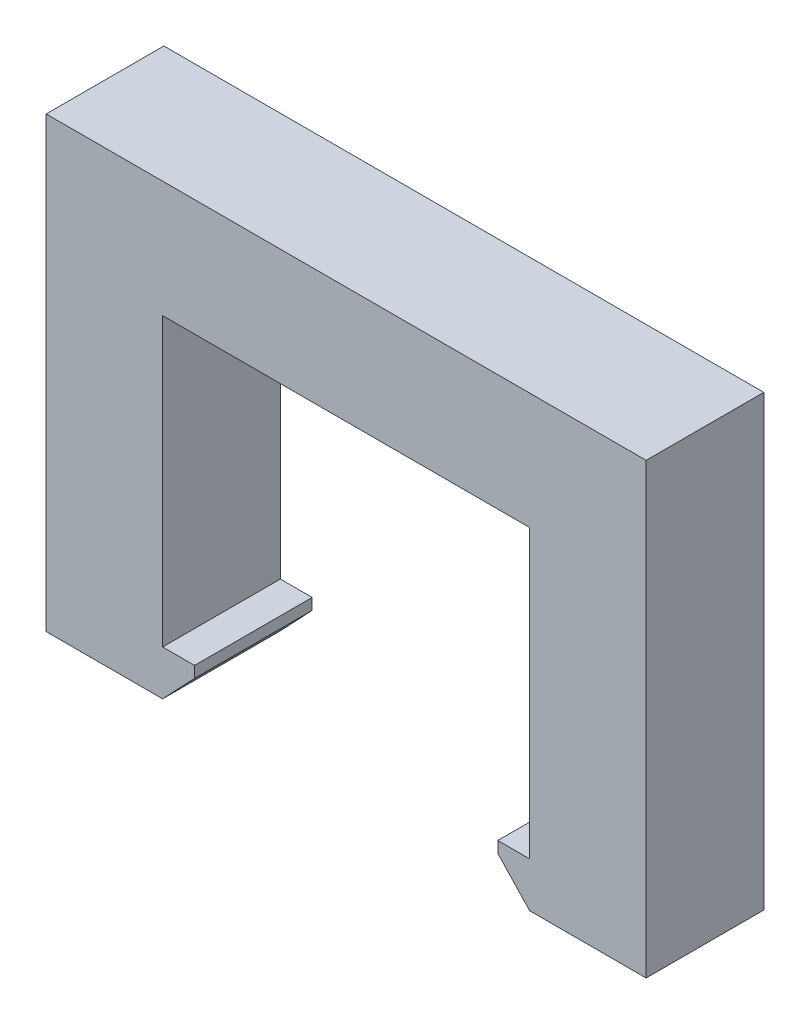
ISO-10303-21;
HEADER;
FILE_DESCRIPTION(('STEP AP214'),'2;1');
FILE_NAME('part.step','',(''),(''),'','','');
FILE_SCHEMA(('AUTOMOTIVE_DESIGN { 1 0 10303 214 1 1 1 1 }'));
ENDSEC;
DATA;
#1=APPLICATION_CONTEXT('core data for automotive mechanical design processes');
#2=APPLICATION_PROTOCOL_DEFINITION('international standard','automotive_design',2000,#1);
#3=PRODUCT_CONTEXT('',#1,'mechanical');
#4=PRODUCT('Part','Part','',(#3));
#5=PRODUCT_RELATED_PRODUCT_CATEGORY('part','',(#4));
#6=PRODUCT_DEFINITION_FORMATION('','',#4);
#7=PRODUCT_DEFINITION_CONTEXT('part definition',#1,'design');
#8=PRODUCT_DEFINITION('design','',#6,#7);
#9=PRODUCT_DEFINITION_SHAPE('','',#8);
#10=(LENGTH_UNIT() NAMED_UNIT(*) SI_UNIT(.MILLI.,.METRE.));
#11=(NAMED_UNIT(*) PLANE_ANGLE_UNIT() SI_UNIT($,.RADIAN.));
#12=(NAMED_UNIT(*) SI_UNIT($,.STERADIAN.) SOLID_ANGLE_UNIT());
#13=UNCERTAINTY_MEASURE_WITH_UNIT(LENGTH_MEASURE(1.E-05),#10,'distance_accuracy_value','');
#14=(GEOMETRIC_REPRESENTATION_CONTEXT(3) GLOBAL_UNCERTAINTY_ASSIGNED_CONTEXT((#13)) GLOBAL_UNIT_ASSIGNED_CONTEXT((#10,
#11,#12)) REPRESENTATION_CONTEXT('',''));
#15=CARTESIAN_POINT('',(0.,0.,0.));
#16=DIRECTION('',(0.,0.,1.));
#17=DIRECTION('',(1.,0.,0.));
#18=AXIS2_PLACEMENT_3D('',#15,#16,#17);
#19=CARTESIAN_POINT('',(0.,0.,12.8016));
#20=DIRECTION('',(0.,-1.,0.));
#21=DIRECTION('',(1.,0.,0.));
#22=AXIS2_PLACEMENT_3D('',#19,#20,#21);
#23=PLANE('',#22);
#24=DIRECTION('',(-1.,0.,0.));
#25=VECTOR('',#24,1.);
#26=CARTESIAN_POINT('',(0.,0.,0.));
#27=LINE('',#26,#25);
#28=CARTESIAN_POINT('',(32.6321247424681,0.,0.));
#29=VERTEX_POINT('',#28);
#30=CARTESIAN_POINT('',(-32.6321247424681,0.,0.));
#31=VERTEX_POINT('',#30);
#32=EDGE_CURVE('E107',#29,#31,#27,.T.);
#33=ORIENTED_EDGE('',*,*,#32,.T.);
#34=DIRECTION('',(0.,0.,-1.));
#35=VECTOR('',#34,1.);
#36=CARTESIAN_POINT('',(-32.6321247424681,0.,12.8016));
#37=LINE('',#36,#35);
#38=CARTESIAN_POINT('',(-32.6321247424681,0.,12.8016));
#39=VERTEX_POINT('',#38);
#40=EDGE_CURVE('E11',#39,#31,#37,.T.);
#41=ORIENTED_EDGE('',*,*,#40,.F.);
#42=DIRECTION('',(-1.,0.,0.));
#43=VECTOR('',#42,1.);
#44=CARTESIAN_POINT('',(0.,0.,12.8016));
#45=LINE('',#44,#43);
#46=CARTESIAN_POINT('',(32.6321247424681,0.,12.8016));
#47=VERTEX_POINT('',#46);
#48=EDGE_CURVE('E114',#47,#39,#45,.T.);
#49=ORIENTED_EDGE('',*,*,#48,.F.);
#50=DIRECTION('',(0.,0.,-1.));
#51=VECTOR('',#50,1.);
#52=CARTESIAN_POINT('',(32.6321247424681,0.,12.8016));
#53=LINE('',#52,#51);
#54=EDGE_CURVE('E170',#47,#29,#53,.T.);
#55=ORIENTED_EDGE('',*,*,#54,.T.);
#56=EDGE_LOOP('',(#33,#41,#49,#55));
#57=FACE_BOUND('',#56,.T.);
#58=ADVANCED_FACE('F39',(#57),#23,.F.);
#59=CARTESIAN_POINT('',(-32.6321247424681,0.,12.8016));
#60=DIRECTION('',(1.,0.,0.));
#61=DIRECTION('',(0.,1.,0.));
#62=AXIS2_PLACEMENT_3D('',#59,#60,#61);
#63=PLANE('',#62);
#64=DIRECTION('',(0.,-1.,0.));
#65=VECTOR('',#64,1.);
#66=CARTESIAN_POINT('',(-32.6321247424681,0.,0.));
#67=LINE('',#66,#65);
#68=CARTESIAN_POINT('',(-32.6321247424681,-48.7706757589646,0.));
#69=VERTEX_POINT('',#68);
#70=EDGE_CURVE('E175',#31,#69,#67,.T.);
#71=ORIENTED_EDGE('',*,*,#70,.T.);
#72=DIRECTION('',(0.,0.,-1.));
#73=VECTOR('',#72,1.);
#74=CARTESIAN_POINT('',(-32.6321247424681,-48.7706757589646,12.8016));
#75=LINE('',#74,#73);
#76=CARTESIAN_POINT('',(-32.6321247424681,-48.7706757589646,12.8016));
#77=VERTEX_POINT('',#76);
#78=EDGE_CURVE('E50',#77,#69,#75,.T.);
#79=ORIENTED_EDGE('',*,*,#78,.F.);
#80=DIRECTION('',(0.,-1.,0.));
#81=VECTOR('',#80,1.);
#82=CARTESIAN_POINT('',(-32.6321247424681,0.,12.8016));
#83=LINE('',#82,#81);
#84=EDGE_CURVE('E274',#39,#77,#83,.T.);
#85=ORIENTED_EDGE('',*,*,#84,.F.);
#86=ORIENTED_EDGE('',*,*,#40,.T.);
#87=EDGE_LOOP('',(#71,#79,#85,#86));
#88=FACE_BOUND('',#87,.T.);
#89=ADVANCED_FACE('F280',(#88),#63,.F.);
#90=CARTESIAN_POINT('',(-32.6321247424681,-48.7706757589646,12.8016));
#91=DIRECTION('',(0.,1.,0.));
#92=DIRECTION('',(0.,0.,1.));
#93=AXIS2_PLACEMENT_3D('',#90,#91,#92);
#94=PLANE('',#93);
#95=DIRECTION('',(1.,0.,0.));
#96=VECTOR('',#95,1.);
#97=CARTESIAN_POINT('',(-32.6321247424681,-48.7706757589646,0.));
#98=LINE('',#97,#96);
#99=CARTESIAN_POINT('',(-19.9644,-48.7706757589646,0.));
#100=VERTEX_POINT('',#99);
#101=EDGE_CURVE('E172',#69,#100,#98,.T.);
#102=ORIENTED_EDGE('',*,*,#101,.T.);
#103=DIRECTION('',(0.,0.,-1.));
#104=VECTOR('',#103,1.);
#105=CARTESIAN_POINT('',(-19.9644,-48.7706757589646,12.8016));
#106=LINE('',#105,#104);
#107=CARTESIAN_POINT('',(-19.9644,-48.7706757589646,12.8016));
#108=VERTEX_POINT('',#107);
#109=EDGE_CURVE('E222',#108,#100,#106,.T.);
#110=ORIENTED_EDGE('',*,*,#109,.F.);
#111=DIRECTION('',(1.,0.,0.));
#112=VECTOR('',#111,1.);
#113=CARTESIAN_POINT('',(-32.6321247424681,-48.7706757589646,12.8016));
#114=LINE('',#113,#112);
#115=EDGE_CURVE('E229',#77,#108,#114,.T.);
#116=ORIENTED_EDGE('',*,*,#115,.F.);
#117=ORIENTED_EDGE('',*,*,#78,.T.);
#118=EDGE_LOOP('',(#102,#110,#116,#117));
#119=FACE_BOUND('',#118,.T.);
#120=ADVANCED_FACE('F226',(#119),#94,.F.);
#121=CARTESIAN_POINT('',(-19.9644,-48.7706757589646,12.8016));
#122=DIRECTION('',(-0.726425661410118,0.687245049778369,0.));
#123=DIRECTION('',(-0.687245049778369,-0.726425661410118,0.));
#124=AXIS2_PLACEMENT_3D('',#121,#122,#123);
#125=PLANE('',#124);
#126=DIRECTION('',(0.687245049778369,0.726425661410118,0.));
#127=VECTOR('',#126,1.);
#128=CARTESIAN_POINT('',(-19.9644,-48.7706757589646,0.));
#129=LINE('',#128,#127);
#130=CARTESIAN_POINT('',(-16.4973,-45.1059124965922,0.));
#131=VERTEX_POINT('',#130);
#132=EDGE_CURVE('E176',#100,#131,#129,.T.);
#133=ORIENTED_EDGE('',*,*,#132,.T.);
#134=DIRECTION('',(0.,0.,-1.));
#135=VECTOR('',#134,1.);
#136=CARTESIAN_POINT('',(-16.4973,-45.1059124965922,12.8016));
#137=LINE('',#136,#135);
#138=CARTESIAN_POINT('',(-16.4973,-45.1059124965922,12.8016));
#139=VERTEX_POINT('',#138);
#140=EDGE_CURVE('E219',#139,#131,#137,.T.);
#141=ORIENTED_EDGE('',*,*,#140,.F.);
#142=DIRECTION('',(0.687245049778369,0.726425661410118,0.));
#143=VECTOR('',#142,1.);
#144=CARTESIAN_POINT('',(-19.9644,-48.7706757589646,12.8016));
#145=LINE('',#144,#143);
#146=EDGE_CURVE('E247',#108,#139,#145,.T.);
#147=ORIENTED_EDGE('',*,*,#146,.F.);
#148=ORIENTED_EDGE('',*,*,#109,.T.);
#149=EDGE_LOOP('',(#133,#141,#147,#148));
#150=FACE_BOUND('',#149,.T.);
#151=ADVANCED_FACE('F237',(#150),#125,.F.);
#152=CARTESIAN_POINT('',(-16.4973,-45.1059124965922,12.8016));
#153=DIRECTION('',(-1.,0.,0.));
#154=DIRECTION('',(0.,-1.,0.));
#155=AXIS2_PLACEMENT_3D('',#152,#153,#154);
#156=PLANE('',#155);
#157=DIRECTION('',(0.,1.,0.));
#158=VECTOR('',#157,1.);
#159=CARTESIAN_POINT('',(-16.4973,-45.1059124965922,0.));
#160=LINE('',#159,#158);
#161=CARTESIAN_POINT('',(-16.4973,-43.8843247424681,0.));
#162=VERTEX_POINT('',#161);
#163=EDGE_CURVE('E178',#131,#162,#160,.T.);
#164=ORIENTED_EDGE('',*,*,#163,.T.);
#165=DIRECTION('',(0.,0.,-1.));
#166=VECTOR('',#165,1.);
#167=CARTESIAN_POINT('',(-16.4973,-43.8843247424681,12.8016));
#168=LINE('',#167,#166);
#169=CARTESIAN_POINT('',(-16.4973,-43.8843247424681,12.8016));
#170=VERTEX_POINT('',#169);
#171=EDGE_CURVE('E214',#170,#162,#168,.T.);
#172=ORIENTED_EDGE('',*,*,#171,.F.);
#173=DIRECTION('',(0.,1.,0.));
#174=VECTOR('',#173,1.);
#175=CARTESIAN_POINT('',(-16.4973,-45.1059124965922,12.8016));
#176=LINE('',#175,#174);
#177=EDGE_CURVE('E244',#139,#170,#176,.T.);
#178=ORIENTED_EDGE('',*,*,#177,.F.);
#179=ORIENTED_EDGE('',*,*,#140,.T.);
#180=EDGE_LOOP('',(#164,#172,#178,#179));
#181=FACE_BOUND('',#180,.T.);
#182=ADVANCED_FACE('F243',(#181),#156,.F.);
#183=CARTESIAN_POINT('',(-16.4973,-43.8843247424681,12.8016));
#184=DIRECTION('',(0.,-1.,0.));
#185=DIRECTION('',(0.,0.,-1.));
#186=AXIS2_PLACEMENT_3D('',#183,#184,#185);
#187=PLANE('',#186);
#188=DIRECTION('',(-1.,0.,0.));
#189=VECTOR('',#188,1.);
#190=CARTESIAN_POINT('',(-16.4973,-43.8843247424681,0.));
#191=LINE('',#190,#189);
#192=CARTESIAN_POINT('',(-19.9644,-43.8843247424681,0.));
#193=VERTEX_POINT('',#192);
#194=EDGE_CURVE('E179',#162,#193,#191,.T.);
#195=ORIENTED_EDGE('',*,*,#194,.T.);
#196=DIRECTION('',(0.,0.,-1.));
#197=VECTOR('',#196,1.);
#198=CARTESIAN_POINT('',(-19.9644,-43.8843247424681,12.8016));
#199=LINE('',#198,#197);
#200=CARTESIAN_POINT('',(-19.9644,-43.8843247424681,12.8016));
#201=VERTEX_POINT('',#200);
#202=EDGE_CURVE('E215',#201,#193,#199,.T.);
#203=ORIENTED_EDGE('',*,*,#202,.F.);
#204=DIRECTION('',(-1.,0.,0.));
#205=VECTOR('',#204,1.);
#206=CARTESIAN_POINT('',(-16.4973,-43.8843247424681,12.8016));
#207=LINE('',#206,#205);
#208=EDGE_CURVE('E250',#170,#201,#207,.T.);
#209=ORIENTED_EDGE('',*,*,#208,.F.);
#210=ORIENTED_EDGE('',*,*,#171,.T.);
#211=EDGE_LOOP('',(#195,#203,#209,#210));
#212=FACE_BOUND('',#211,.T.);
#213=ADVANCED_FACE('F286',(#212),#187,.F.);
#214=CARTESIAN_POINT('',(-19.9644,-43.8843247424681,12.8016));
#215=DIRECTION('',(-1.,0.,0.));
#216=DIRECTION('',(0.,-1.,0.));
#217=AXIS2_PLACEMENT_3D('',#214,#215,#216);
#218=PLANE('',#217);
#219=DIRECTION('',(0.,1.,0.));
#220=VECTOR('',#219,1.);
#221=CARTESIAN_POINT('',(-19.9644,-43.8843247424681,0.));
#222=LINE('',#221,#220);
#223=CARTESIAN_POINT('',(-19.9644,-12.6677247424681,0.));
#224=VERTEX_POINT('',#223);
#225=EDGE_CURVE('E185',#193,#224,#222,.T.);
#226=ORIENTED_EDGE('',*,*,#225,.T.);
#227=DIRECTION('',(0.,0.,-1.));
#228=VECTOR('',#227,1.);
#229=CARTESIAN_POINT('',(-19.9644,-12.6677247424681,12.8016));
#230=LINE('',#229,#228);
#231=CARTESIAN_POINT('',(-19.9644,-12.6677247424681,12.8016));
#232=VERTEX_POINT('',#231);
#233=EDGE_CURVE('E209',#232,#224,#230,.T.);
#234=ORIENTED_EDGE('',*,*,#233,.F.);
#235=DIRECTION('',(0.,1.,0.));
#236=VECTOR('',#235,1.);
#237=CARTESIAN_POINT('',(-19.9644,-43.8843247424681,12.8016));
#238=LINE('',#237,#236);
#239=EDGE_CURVE('E249',#201,#232,#238,.T.);
#240=ORIENTED_EDGE('',*,*,#239,.F.);
#241=ORIENTED_EDGE('',*,*,#202,.T.);
#242=EDGE_LOOP('',(#226,#234,#240,#241));
#243=FACE_BOUND('',#242,.T.);
#244=ADVANCED_FACE('F292',(#243),#218,.F.);
#245=CARTESIAN_POINT('',(-19.9644,-12.6677247424681,12.8016));
#246=DIRECTION('',(0.,1.,0.));
#247=DIRECTION('',(-1.,0.,0.));
#248=AXIS2_PLACEMENT_3D('',#245,#246,#247);
#249=PLANE('',#248);
#250=DIRECTION('',(1.,0.,0.));
#251=VECTOR('',#250,1.);
#252=CARTESIAN_POINT('',(-19.9644,-12.6677247424681,0.));
#253=LINE('',#252,#251);
#254=CARTESIAN_POINT('',(19.9644,-12.6677247424681,0.));
#255=VERTEX_POINT('',#254);
#256=EDGE_CURVE('E183',#224,#255,#253,.T.);
#257=ORIENTED_EDGE('',*,*,#256,.T.);
#258=DIRECTION('',(0.,0.,-1.));
#259=VECTOR('',#258,1.);
#260=CARTESIAN_POINT('',(19.9644,-12.6677247424681,12.8016));
#261=LINE('',#260,#259);
#262=CARTESIAN_POINT('',(19.9644,-12.6677247424681,12.8016));
#263=VERTEX_POINT('',#262);
#264=EDGE_CURVE('E207',#263,#255,#261,.T.);
#265=ORIENTED_EDGE('',*,*,#264,.F.);
#266=DIRECTION('',(1.,0.,0.));
#267=VECTOR('',#266,1.);
#268=CARTESIAN_POINT('',(-19.9644,-12.6677247424681,12.8016));
#269=LINE('',#268,#267);
#270=EDGE_CURVE('E256',#232,#263,#269,.T.);
#271=ORIENTED_EDGE('',*,*,#270,.F.);
#272=ORIENTED_EDGE('',*,*,#233,.T.);
#273=EDGE_LOOP('',(#257,#265,#271,#272));
#274=FACE_BOUND('',#273,.T.);
#275=ADVANCED_FACE('F298',(#274),#249,.F.);
#276=CARTESIAN_POINT('',(19.9644,-43.8843247424681,12.8016));
#277=DIRECTION('',(1.,0.,0.));
#278=DIRECTION('',(0.,0.,-1.));
#279=AXIS2_PLACEMENT_3D('',#276,#277,#278);
#280=PLANE('',#279);
#281=DIRECTION('',(0.,-1.,0.));
#282=VECTOR('',#281,1.);
#283=CARTESIAN_POINT('',(19.9644,-43.8843247424681,0.));
#284=LINE('',#283,#282);
#285=CARTESIAN_POINT('',(19.9644,-43.8843247424681,0.));
#286=VERTEX_POINT('',#285);
#287=EDGE_CURVE('E187',#255,#286,#284,.T.);
#288=ORIENTED_EDGE('',*,*,#287,.T.);
#289=DIRECTION('',(0.,0.,-1.));
#290=VECTOR('',#289,1.);
#291=CARTESIAN_POINT('',(19.9644,-43.8843247424681,12.8016));
#292=LINE('',#291,#290);
#293=CARTESIAN_POINT('',(19.9644,-43.8843247424681,12.8016));
#294=VERTEX_POINT('',#293);
#295=EDGE_CURVE('E204',#294,#286,#292,.T.);
#296=ORIENTED_EDGE('',*,*,#295,.F.);
#297=DIRECTION('',(0.,-1.,0.));
#298=VECTOR('',#297,1.);
#299=CARTESIAN_POINT('',(19.9644,-43.8843247424681,12.8016));
#300=LINE('',#299,#298);
#301=EDGE_CURVE('E257',#263,#294,#300,.T.);
#302=ORIENTED_EDGE('',*,*,#301,.F.);
#303=ORIENTED_EDGE('',*,*,#264,.T.);
#304=EDGE_LOOP('',(#288,#296,#302,#303));
#305=FACE_BOUND('',#304,.T.);
#306=ADVANCED_FACE('F297',(#305),#280,.F.);
#307=CARTESIAN_POINT('',(16.4973,-43.8843247424681,12.8016));
#308=DIRECTION('',(0.,-1.,0.));
#309=DIRECTION('',(0.,0.,-1.));
#310=AXIS2_PLACEMENT_3D('',#307,#308,#309);
#311=PLANE('',#310);
#312=DIRECTION('',(-1.,0.,0.));
#313=VECTOR('',#312,1.);
#314=CARTESIAN_POINT('',(16.4973,-43.8843247424681,0.));
#315=LINE('',#314,#313);
#316=CARTESIAN_POINT('',(16.4973,-43.8843247424681,0.));
#317=VERTEX_POINT('',#316);
#318=EDGE_CURVE('E189',#286,#317,#315,.T.);
#319=ORIENTED_EDGE('',*,*,#318,.T.);
#320=DIRECTION('',(0.,0.,-1.));
#321=VECTOR('',#320,1.);
#322=CARTESIAN_POINT('',(16.4973,-43.8843247424681,12.8016));
#323=LINE('',#322,#321);
#324=CARTESIAN_POINT('',(16.4973,-43.8843247424681,12.8016));
#325=VERTEX_POINT('',#324);
#326=EDGE_CURVE('E198',#325,#317,#323,.T.);
#327=ORIENTED_EDGE('',*,*,#326,.F.);
#328=DIRECTION('',(-1.,0.,0.));
#329=VECTOR('',#328,1.);
#330=CARTESIAN_POINT('',(16.4973,-43.8843247424681,12.8016));
#331=LINE('',#330,#329);
#332=EDGE_CURVE('E259',#294,#325,#331,.T.);
#333=ORIENTED_EDGE('',*,*,#332,.F.);
#334=ORIENTED_EDGE('',*,*,#295,.T.);
#335=EDGE_LOOP('',(#319,#327,#333,#334));
#336=FACE_BOUND('',#335,.T.);
#337=ADVANCED_FACE('F267',(#336),#311,.F.);
#338=CARTESIAN_POINT('',(16.4973,-45.1059124965922,12.8016));
#339=DIRECTION('',(1.,0.,0.));
#340=DIRECTION('',(0.,1.,0.));
#341=AXIS2_PLACEMENT_3D('',#338,#339,#340);
#342=PLANE('',#341);
#343=DIRECTION('',(0.,-1.,0.));
#344=VECTOR('',#343,1.);
#345=CARTESIAN_POINT('',(16.4973,-45.1059124965922,0.));
#346=LINE('',#345,#344);
#347=CARTESIAN_POINT('',(16.4973,-45.1059124965922,0.));
#348=VERTEX_POINT('',#347);
#349=EDGE_CURVE('E188',#317,#348,#346,.T.);
#350=ORIENTED_EDGE('',*,*,#349,.T.);
#351=DIRECTION('',(0.,0.,-1.));
#352=VECTOR('',#351,1.);
#353=CARTESIAN_POINT('',(16.4973,-45.1059124965922,12.8016));
#354=LINE('',#353,#352);
#355=CARTESIAN_POINT('',(16.4973,-45.1059124965922,12.8016));
#356=VERTEX_POINT('',#355);
#357=EDGE_CURVE('E162',#356,#348,#354,.T.);
#358=ORIENTED_EDGE('',*,*,#357,.F.);
#359=DIRECTION('',(0.,-1.,0.));
#360=VECTOR('',#359,1.);
#361=CARTESIAN_POINT('',(16.4973,-45.1059124965922,12.8016));
#362=LINE('',#361,#360);
#363=EDGE_CURVE('E154',#325,#356,#362,.T.);
#364=ORIENTED_EDGE('',*,*,#363,.F.);
#365=ORIENTED_EDGE('',*,*,#326,.T.);
#366=EDGE_LOOP('',(#350,#358,#364,#365));
#367=FACE_BOUND('',#366,.T.);
#368=ADVANCED_FACE('F268',(#367),#342,.F.);
#369=CARTESIAN_POINT('',(19.9644,-48.7706757589646,12.8016));
#370=DIRECTION('',(0.726425661410118,0.687245049778369,0.));
#371=DIRECTION('',(-0.687245049778369,0.726425661410118,0.));
#372=AXIS2_PLACEMENT_3D('',#369,#370,#371);
#373=PLANE('',#372);
#374=DIRECTION('',(0.687245049778369,-0.726425661410118,0.));
#375=VECTOR('',#374,1.);
#376=CARTESIAN_POINT('',(19.9644,-48.7706757589646,0.));
#377=LINE('',#376,#375);
#378=CARTESIAN_POINT('',(19.9644,-48.7706757589646,0.));
#379=VERTEX_POINT('',#378);
#380=EDGE_CURVE('E163',#348,#379,#377,.T.);
#381=ORIENTED_EDGE('',*,*,#380,.T.);
#382=DIRECTION('',(0.,0.,-1.));
#383=VECTOR('',#382,1.);
#384=CARTESIAN_POINT('',(19.9644,-48.7706757589646,12.8016));
#385=LINE('',#384,#383);
#386=CARTESIAN_POINT('',(19.9644,-48.7706757589646,12.8016));
#387=VERTEX_POINT('',#386);
#388=EDGE_CURVE('E159',#387,#379,#385,.T.);
#389=ORIENTED_EDGE('',*,*,#388,.F.);
#390=DIRECTION('',(0.687245049778369,-0.726425661410118,0.));
#391=VECTOR('',#390,1.);
#392=CARTESIAN_POINT('',(19.9644,-48.7706757589646,12.8016));
#393=LINE('',#392,#391);
#394=EDGE_CURVE('E150',#356,#387,#393,.T.);
#395=ORIENTED_EDGE('',*,*,#394,.F.);
#396=ORIENTED_EDGE('',*,*,#357,.T.);
#397=EDGE_LOOP('',(#381,#389,#395,#396));
#398=FACE_BOUND('',#397,.T.);
#399=ADVANCED_FACE('F156',(#398),#373,.F.);
#400=CARTESIAN_POINT('',(32.6321247424681,-48.7706757589646,12.8016));
#401=DIRECTION('',(0.,1.,0.));
#402=DIRECTION('',(0.,0.,1.));
#403=AXIS2_PLACEMENT_3D('',#400,#401,#402);
#404=PLANE('',#403);
#405=DIRECTION('',(1.,0.,0.));
#406=VECTOR('',#405,1.);
#407=CARTESIAN_POINT('',(32.6321247424681,-48.7706757589646,0.));
#408=LINE('',#407,#406);
#409=CARTESIAN_POINT('',(32.6321247424681,-48.7706757589646,0.));
#410=VERTEX_POINT('',#409);
#411=EDGE_CURVE('E105',#379,#410,#408,.T.);
#412=ORIENTED_EDGE('',*,*,#411,.T.);
#413=DIRECTION('',(0.,0.,-1.));
#414=VECTOR('',#413,1.);
#415=CARTESIAN_POINT('',(32.6321247424681,-48.7706757589646,12.8016));
#416=LINE('',#415,#414);
#417=CARTESIAN_POINT('',(32.6321247424681,-48.7706757589646,12.8016));
#418=VERTEX_POINT('',#417);
#419=EDGE_CURVE('E161',#418,#410,#416,.T.);
#420=ORIENTED_EDGE('',*,*,#419,.F.);
#421=DIRECTION('',(1.,0.,0.));
#422=VECTOR('',#421,1.);
#423=CARTESIAN_POINT('',(32.6321247424681,-48.7706757589646,12.8016));
#424=LINE('',#423,#422);
#425=EDGE_CURVE('E152',#387,#418,#424,.T.);
#426=ORIENTED_EDGE('',*,*,#425,.F.);
#427=ORIENTED_EDGE('',*,*,#388,.T.);
#428=EDGE_LOOP('',(#412,#420,#426,#427));
#429=FACE_BOUND('',#428,.T.);
#430=ADVANCED_FACE('F164',(#429),#404,.F.);
#431=CARTESIAN_POINT('',(32.6321247424681,0.,12.8016));
#432=DIRECTION('',(-1.,0.,0.));
#433=DIRECTION('',(0.,-1.,0.));
#434=AXIS2_PLACEMENT_3D('',#431,#432,#433);
#435=PLANE('',#434);
#436=DIRECTION('',(0.,1.,0.));
#437=VECTOR('',#436,1.);
#438=CARTESIAN_POINT('',(32.6321247424681,0.,0.));
#439=LINE('',#438,#437);
#440=EDGE_CURVE('E193',#410,#29,#439,.T.);
#441=ORIENTED_EDGE('',*,*,#440,.T.);
#442=ORIENTED_EDGE('',*,*,#54,.F.);
#443=DIRECTION('',(0.,1.,0.));
#444=VECTOR('',#443,1.);
#445=CARTESIAN_POINT('',(32.6321247424681,0.,12.8016));
#446=LINE('',#445,#444);
#447=EDGE_CURVE('E54',#418,#47,#446,.T.);
#448=ORIENTED_EDGE('',*,*,#447,.F.);
#449=ORIENTED_EDGE('',*,*,#419,.T.);
#450=EDGE_LOOP('',(#441,#442,#448,#449));
#451=FACE_BOUND('',#450,.T.);
#452=ADVANCED_FACE('F275',(#451),#435,.F.);
#453=CARTESIAN_POINT('',(0.,0.,12.8016));
#454=DIRECTION('',(0.,0.,-1.));
#455=DIRECTION('',(-1.,0.,0.));
#456=AXIS2_PLACEMENT_3D('',#453,#454,#455);
#457=PLANE('',#456);
#458=ORIENTED_EDGE('',*,*,#48,.T.);
#459=ORIENTED_EDGE('',*,*,#84,.T.);
#460=ORIENTED_EDGE('',*,*,#115,.T.);
#461=ORIENTED_EDGE('',*,*,#146,.T.);
#462=ORIENTED_EDGE('',*,*,#177,.T.);
#463=ORIENTED_EDGE('',*,*,#208,.T.);
#464=ORIENTED_EDGE('',*,*,#239,.T.);
#465=ORIENTED_EDGE('',*,*,#270,.T.);
#466=ORIENTED_EDGE('',*,*,#301,.T.);
#467=ORIENTED_EDGE('',*,*,#332,.T.);
#468=ORIENTED_EDGE('',*,*,#363,.T.);
#469=ORIENTED_EDGE('',*,*,#394,.T.);
#470=ORIENTED_EDGE('',*,*,#425,.T.);
#471=ORIENTED_EDGE('',*,*,#447,.T.);
#472=EDGE_LOOP('',(#458,#459,#460,#461,#462,#463,#464,#465,#466,#467,#468,#469,#470,#471));
#473=FACE_BOUND('',#472,.T.);
#474=ADVANCED_FACE('F148',(#473),#457,.F.);
#475=CARTESIAN_POINT('',(0.,0.,0.));
#476=DIRECTION('',(0.,0.,-1.));
#477=DIRECTION('',(-1.,0.,0.));
#478=AXIS2_PLACEMENT_3D('',#475,#476,#477);
#479=PLANE('',#478);
#480=ORIENTED_EDGE('',*,*,#32,.F.);
#481=ORIENTED_EDGE('',*,*,#440,.F.);
#482=ORIENTED_EDGE('',*,*,#411,.F.);
#483=ORIENTED_EDGE('',*,*,#380,.F.);
#484=ORIENTED_EDGE('',*,*,#349,.F.);
#485=ORIENTED_EDGE('',*,*,#318,.F.);
#486=ORIENTED_EDGE('',*,*,#287,.F.);
#487=ORIENTED_EDGE('',*,*,#256,.F.);
#488=ORIENTED_EDGE('',*,*,#225,.F.);
#489=ORIENTED_EDGE('',*,*,#194,.F.);
#490=ORIENTED_EDGE('',*,*,#163,.F.);
#491=ORIENTED_EDGE('',*,*,#132,.F.);
#492=ORIENTED_EDGE('',*,*,#101,.F.);
#493=ORIENTED_EDGE('',*,*,#70,.F.);
#494=EDGE_LOOP('',(#480,#481,#482,#483,#484,#485,#486,#487,#488,#489,#490,#491,#492,#493));
#495=FACE_BOUND('',#494,.T.);
#496=ADVANCED_FACE('F234',(#495),#479,.T.);
#497=CLOSED_SHELL('',(#58,#89,#120,#151,#182,#213,#244,#275,#306,#337,#368,#399,#430,#452,#474,#496));
#498=MANIFOLD_SOLID_BREP('B2',#497);
#499=ADVANCED_BREP_SHAPE_REPRESENTATION('',(#18,#498),#14);
#500=SHAPE_DEFINITION_REPRESENTATION(#9,#499);
ENDSEC;
END-ISO-10303-21;
